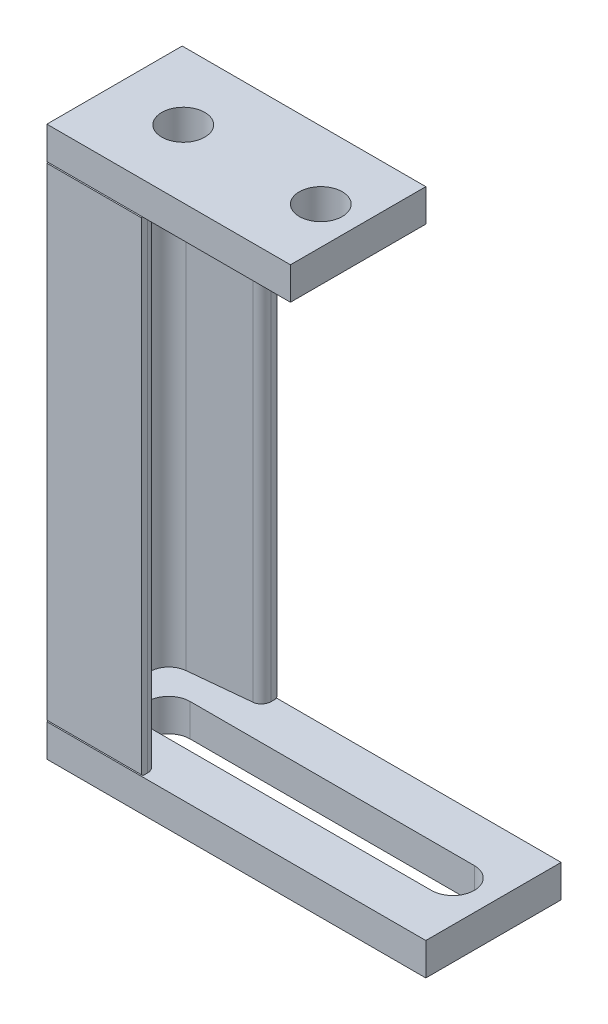
ISO-10303-21;
HEADER;
FILE_DESCRIPTION(('STEP AP214'),'2;1');
FILE_NAME('part.step','',(''),(''),'','','');
FILE_SCHEMA(('AUTOMOTIVE_DESIGN { 1 0 10303 214 1 1 1 1 }'));
ENDSEC;
DATA;
#1=APPLICATION_CONTEXT('core data for automotive mechanical design processes');
#2=APPLICATION_PROTOCOL_DEFINITION('international standard','automotive_design',2000,#1);
#3=PRODUCT_CONTEXT('',#1,'mechanical');
#4=PRODUCT('Part','Part','',(#3));
#5=PRODUCT_RELATED_PRODUCT_CATEGORY('part','',(#4));
#6=PRODUCT_DEFINITION_FORMATION('','',#4);
#7=PRODUCT_DEFINITION_CONTEXT('part definition',#1,'design');
#8=PRODUCT_DEFINITION('design','',#6,#7);
#9=PRODUCT_DEFINITION_SHAPE('','',#8);
#10=(LENGTH_UNIT() NAMED_UNIT(*) SI_UNIT(.MILLI.,.METRE.));
#11=(NAMED_UNIT(*) PLANE_ANGLE_UNIT() SI_UNIT($,.RADIAN.));
#12=(NAMED_UNIT(*) SI_UNIT($,.STERADIAN.) SOLID_ANGLE_UNIT());
#13=UNCERTAINTY_MEASURE_WITH_UNIT(LENGTH_MEASURE(1.E-05),#10,'distance_accuracy_value','');
#14=(GEOMETRIC_REPRESENTATION_CONTEXT(3) GLOBAL_UNCERTAINTY_ASSIGNED_CONTEXT((#13)) GLOBAL_UNIT_ASSIGNED_CONTEXT((#10,
#11,#12)) REPRESENTATION_CONTEXT('',''));
#15=CARTESIAN_POINT('',(0.,0.,0.));
#16=DIRECTION('',(0.,0.,1.));
#17=DIRECTION('',(1.,0.,0.));
#18=AXIS2_PLACEMENT_3D('',#15,#16,#17);
#19=CARTESIAN_POINT('',(35.,0.,0.));
#20=DIRECTION('',(1.,0.,0.));
#21=DIRECTION('',(0.,0.,-1.));
#22=AXIS2_PLACEMENT_3D('',#19,#20,#21);
#23=PLANE('',#22);
#24=DIRECTION('',(0.,0.,-1.));
#25=VECTOR('',#24,1.);
#26=CARTESIAN_POINT('',(35.,1.06001762654536E-08,0.));
#27=LINE('',#26,#25);
#28=CARTESIAN_POINT('',(35.,1.06001762654536E-08,24.5000000106002));
#29=VERTEX_POINT('',#28);
#30=CARTESIAN_POINT('',(35.,1.06001762654536E-08,22.7900106818747));
#31=VERTEX_POINT('',#30);
#32=EDGE_CURVE('E363',#29,#31,#27,.T.);
#33=ORIENTED_EDGE('',*,*,#32,.T.);
#34=DIRECTION('',(0.,1.,0.));
#35=VECTOR('',#34,1.);
#36=CARTESIAN_POINT('',(35.,179.2,22.7900106818747));
#37=LINE('',#36,#35);
#38=CARTESIAN_POINT('',(35.,179.2,22.7900106818747));
#39=VERTEX_POINT('',#38);
#40=EDGE_CURVE('E376',#31,#39,#37,.T.);
#41=ORIENTED_EDGE('',*,*,#40,.T.);
#42=DIRECTION('',(0.,0.,-1.));
#43=VECTOR('',#42,1.);
#44=CARTESIAN_POINT('',(35.,179.2,24.5));
#45=LINE('',#44,#43);
#46=CARTESIAN_POINT('',(35.,179.2,24.5));
#47=VERTEX_POINT('',#46);
#48=EDGE_CURVE('E307',#47,#39,#45,.T.);
#49=ORIENTED_EDGE('',*,*,#48,.F.);
#50=DIRECTION('',(0.,0.707106781186547,-0.707106781186547));
#51=VECTOR('',#50,1.);
#52=CARTESIAN_POINT('',(35.,178.7,25.));
#53=LINE('',#52,#51);
#54=CARTESIAN_POINT('',(35.,178.7,25.));
#55=VERTEX_POINT('',#54);
#56=EDGE_CURVE('E303',#55,#47,#53,.T.);
#57=ORIENTED_EDGE('',*,*,#56,.F.);
#58=DIRECTION('',(0.,1.,0.));
#59=VECTOR('',#58,1.);
#60=CARTESIAN_POINT('',(35.,0.5000000192,25.));
#61=LINE('',#60,#59);
#62=CARTESIAN_POINT('',(35.,0.5000000192,25.));
#63=VERTEX_POINT('',#62);
#64=EDGE_CURVE('E300',#63,#55,#61,.T.);
#65=ORIENTED_EDGE('',*,*,#64,.F.);
#66=DIRECTION('',(0.,0.707106794762982,0.707106767610112));
#67=VECTOR('',#66,1.);
#68=CARTESIAN_POINT('',(35.,0.,24.5));
#69=LINE('',#68,#67);
#70=EDGE_CURVE('E297',#29,#63,#69,.T.);
#71=ORIENTED_EDGE('',*,*,#70,.F.);
#72=EDGE_LOOP('',(#33,#41,#49,#57,#65,#71));
#73=FACE_BOUND('',#72,.T.);
#74=ADVANCED_FACE('F36',(#73),#23,.T.);
#75=CARTESIAN_POINT('',(35.,179.2,-22.7900106818747));
#76=VERTEX_POINT('',#75);
#77=CARTESIAN_POINT('',(35.,179.2,-24.5));
#78=VERTEX_POINT('',#77);
#79=EDGE_CURVE('E306',#76,#78,#45,.T.);
#80=ORIENTED_EDGE('',*,*,#79,.F.);
#81=DIRECTION('',(0.,-1.,0.));
#82=VECTOR('',#81,1.);
#83=CARTESIAN_POINT('',(35.,1.06001762041178E-08,-22.7900106818747));
#84=LINE('',#83,#82);
#85=CARTESIAN_POINT('',(35.,1.06001762654536E-08,-22.7900106818747));
#86=VERTEX_POINT('',#85);
#87=EDGE_CURVE('E381',#76,#86,#84,.T.);
#88=ORIENTED_EDGE('',*,*,#87,.T.);
#89=CARTESIAN_POINT('',(35.,1.06001762654536E-08,-24.5));
#90=VERTEX_POINT('',#89);
#91=EDGE_CURVE('E367',#86,#90,#27,.T.);
#92=ORIENTED_EDGE('',*,*,#91,.T.);
#93=DIRECTION('',(0.,-0.707106781186547,0.707106781186548));
#94=VECTOR('',#93,1.);
#95=CARTESIAN_POINT('',(35.,0.5,-25.));
#96=LINE('',#95,#94);
#97=CARTESIAN_POINT('',(35.,0.5,-25.));
#98=VERTEX_POINT('',#97);
#99=EDGE_CURVE('E293',#98,#90,#96,.T.);
#100=ORIENTED_EDGE('',*,*,#99,.F.);
#101=DIRECTION('',(0.,-1.,0.));
#102=VECTOR('',#101,1.);
#103=CARTESIAN_POINT('',(35.,178.7,-25.));
#104=LINE('',#103,#102);
#105=CARTESIAN_POINT('',(35.,178.7,-25.));
#106=VERTEX_POINT('',#105);
#107=EDGE_CURVE('E290',#106,#98,#104,.T.);
#108=ORIENTED_EDGE('',*,*,#107,.F.);
#109=DIRECTION('',(0.,-0.707106781186547,-0.707106781186547));
#110=VECTOR('',#109,1.);
#111=CARTESIAN_POINT('',(35.,179.2,-24.5));
#112=LINE('',#111,#110);
#113=EDGE_CURVE('E310',#78,#106,#112,.T.);
#114=ORIENTED_EDGE('',*,*,#113,.F.);
#115=EDGE_LOOP('',(#80,#88,#92,#100,#108,#114));
#116=FACE_BOUND('',#115,.T.);
#117=ADVANCED_FACE('F425',(#116),#23,.T.);
#118=CARTESIAN_POINT('',(90.,191.1999999944,25.));
#119=DIRECTION('',(0.,0.,1.));
#120=DIRECTION('',(1.,0.,0.));
#121=AXIS2_PLACEMENT_3D('',#118,#119,#120);
#122=PLANE('',#121);
#123=DIRECTION('',(-1.,0.,0.));
#124=VECTOR('',#123,1.);
#125=CARTESIAN_POINT('',(90.,179.2,25.));
#126=LINE('',#125,#124);
#127=CARTESIAN_POINT('',(90.,179.2,25.));
#128=VERTEX_POINT('',#127);
#129=CARTESIAN_POINT('',(0.,179.2,25.));
#130=VERTEX_POINT('',#129);
#131=EDGE_CURVE('E343',#128,#130,#126,.T.);
#132=ORIENTED_EDGE('',*,*,#131,.F.);
#133=DIRECTION('',(0.,-1.,0.));
#134=VECTOR('',#133,1.);
#135=CARTESIAN_POINT('',(90.,191.1999999944,25.));
#136=LINE('',#135,#134);
#137=CARTESIAN_POINT('',(90.,191.1999999944,25.));
#138=VERTEX_POINT('',#137);
#139=EDGE_CURVE('E461',#138,#128,#136,.T.);
#140=ORIENTED_EDGE('',*,*,#139,.F.);
#141=DIRECTION('',(-1.,0.,0.));
#142=VECTOR('',#141,1.);
#143=CARTESIAN_POINT('',(90.,191.1999999944,25.));
#144=LINE('',#143,#142);
#145=CARTESIAN_POINT('',(0.,191.1999999944,25.));
#146=VERTEX_POINT('',#145);
#147=EDGE_CURVE('E460',#138,#146,#144,.T.);
#148=ORIENTED_EDGE('',*,*,#147,.T.);
#149=DIRECTION('',(0.,-1.,0.));
#150=VECTOR('',#149,1.);
#151=CARTESIAN_POINT('',(0.,191.1999999944,25.));
#152=LINE('',#151,#150);
#153=EDGE_CURVE('E465',#146,#130,#152,.T.);
#154=ORIENTED_EDGE('',*,*,#153,.T.);
#155=EDGE_LOOP('',(#132,#140,#148,#154));
#156=FACE_BOUND('',#155,.T.);
#157=ADVANCED_FACE('F516',(#156),#122,.T.);
#158=CARTESIAN_POINT('',(90.,191.1999999944,-25.));
#159=DIRECTION('',(1.,0.,0.));
#160=DIRECTION('',(0.,0.,-1.));
#161=AXIS2_PLACEMENT_3D('',#158,#159,#160);
#162=PLANE('',#161);
#163=DIRECTION('',(0.,0.,1.));
#164=VECTOR('',#163,1.);
#165=CARTESIAN_POINT('',(90.,179.2,-25.));
#166=LINE('',#165,#164);
#167=CARTESIAN_POINT('',(90.,179.2,-25.));
#168=VERTEX_POINT('',#167);
#169=EDGE_CURVE('E457',#168,#128,#166,.T.);
#170=ORIENTED_EDGE('',*,*,#169,.F.);
#171=DIRECTION('',(0.,-1.,0.));
#172=VECTOR('',#171,1.);
#173=CARTESIAN_POINT('',(90.,191.1999999944,-25.));
#174=LINE('',#173,#172);
#175=CARTESIAN_POINT('',(90.,191.1999999944,-25.));
#176=VERTEX_POINT('',#175);
#177=EDGE_CURVE('E463',#176,#168,#174,.T.);
#178=ORIENTED_EDGE('',*,*,#177,.F.);
#179=DIRECTION('',(0.,0.,1.));
#180=VECTOR('',#179,1.);
#181=CARTESIAN_POINT('',(90.,191.1999999944,-25.));
#182=LINE('',#181,#180);
#183=EDGE_CURVE('E466',#176,#138,#182,.T.);
#184=ORIENTED_EDGE('',*,*,#183,.T.);
#185=ORIENTED_EDGE('',*,*,#139,.T.);
#186=EDGE_LOOP('',(#170,#178,#184,#185));
#187=FACE_BOUND('',#186,.T.);
#188=ADVANCED_FACE('F518',(#187),#162,.T.);
#189=CARTESIAN_POINT('',(0.,191.1999999944,-25.));
#190=DIRECTION('',(0.,0.,-1.));
#191=DIRECTION('',(-1.,0.,0.));
#192=AXIS2_PLACEMENT_3D('',#189,#190,#191);
#193=PLANE('',#192);
#194=DIRECTION('',(1.,0.,0.));
#195=VECTOR('',#194,1.);
#196=CARTESIAN_POINT('',(0.,179.2,-25.));
#197=LINE('',#196,#195);
#198=CARTESIAN_POINT('',(0.,179.2,-25.));
#199=VERTEX_POINT('',#198);
#200=EDGE_CURVE('E446',#199,#168,#197,.T.);
#201=ORIENTED_EDGE('',*,*,#200,.F.);
#202=DIRECTION('',(0.,-1.,0.));
#203=VECTOR('',#202,1.);
#204=CARTESIAN_POINT('',(0.,191.1999999944,-25.));
#205=LINE('',#204,#203);
#206=CARTESIAN_POINT('',(0.,191.1999999944,-25.));
#207=VERTEX_POINT('',#206);
#208=EDGE_CURVE('E441',#207,#199,#205,.T.);
#209=ORIENTED_EDGE('',*,*,#208,.F.);
#210=DIRECTION('',(1.,0.,0.));
#211=VECTOR('',#210,1.);
#212=CARTESIAN_POINT('',(0.,191.1999999944,-25.));
#213=LINE('',#212,#211);
#214=EDGE_CURVE('E471',#207,#176,#213,.T.);
#215=ORIENTED_EDGE('',*,*,#214,.T.);
#216=ORIENTED_EDGE('',*,*,#177,.T.);
#217=EDGE_LOOP('',(#201,#209,#215,#216));
#218=FACE_BOUND('',#217,.T.);
#219=ADVANCED_FACE('F520',(#218),#193,.T.);
#220=CARTESIAN_POINT('',(0.,191.1999999944,25.));
#221=DIRECTION('',(-1.,0.,0.));
#222=DIRECTION('',(0.,0.,1.));
#223=AXIS2_PLACEMENT_3D('',#220,#221,#222);
#224=PLANE('',#223);
#225=CARTESIAN_POINT('',(0.,89.6,0.));
#226=DIRECTION('',(-1.,0.,0.));
#227=DIRECTION('',(0.,0.,1.));
#228=AXIS2_PLACEMENT_3D('',#225,#226,#227);
#229=CIRCLE('',#228,7.93999999999999);
#230=CARTESIAN_POINT('',(0.,89.6,7.93999999999999));
#231=VERTEX_POINT('',#230);
#232=EDGE_CURVE('E588',#231,#231,#229,.T.);
#233=ORIENTED_EDGE('',*,*,#232,.F.);
#234=EDGE_LOOP('',(#233));
#235=FACE_BOUND('',#234,.T.);
#236=CARTESIAN_POINT('',(0.,115.,0.));
#237=DIRECTION('',(-1.,0.,0.));
#238=DIRECTION('',(0.,0.,1.));
#239=AXIS2_PLACEMENT_3D('',#236,#237,#238);
#240=CIRCLE('',#239,7.93999999999999);
#241=CARTESIAN_POINT('',(0.,115.,7.93999999999999));
#242=VERTEX_POINT('',#241);
#243=EDGE_CURVE('E599',#242,#242,#240,.T.);
#244=ORIENTED_EDGE('',*,*,#243,.F.);
#245=EDGE_LOOP('',(#244));
#246=FACE_BOUND('',#245,.T.);
#247=CARTESIAN_POINT('',(0.,140.4,0.));
#248=DIRECTION('',(-1.,0.,0.));
#249=DIRECTION('',(0.,0.,1.));
#250=AXIS2_PLACEMENT_3D('',#247,#248,#249);
#251=CIRCLE('',#250,7.93999999999997);
#252=CARTESIAN_POINT('',(0.,140.4,7.93999999999997));
#253=VERTEX_POINT('',#252);
#254=EDGE_CURVE('E605',#253,#253,#251,.T.);
#255=ORIENTED_EDGE('',*,*,#254,.F.);
#256=EDGE_LOOP('',(#255));
#257=FACE_BOUND('',#256,.T.);
#258=CARTESIAN_POINT('',(0.,165.8,0.));
#259=DIRECTION('',(-1.,0.,0.));
#260=DIRECTION('',(0.,0.,1.));
#261=AXIS2_PLACEMENT_3D('',#258,#259,#260);
#262=CIRCLE('',#261,7.94);
#263=CARTESIAN_POINT('',(0.,165.8,7.94));
#264=VERTEX_POINT('',#263);
#265=EDGE_CURVE('E611',#264,#264,#262,.T.);
#266=ORIENTED_EDGE('',*,*,#265,.F.);
#267=EDGE_LOOP('',(#266));
#268=FACE_BOUND('',#267,.T.);
#269=CARTESIAN_POINT('',(0.,38.8,0.));
#270=DIRECTION('',(-1.,0.,0.));
#271=DIRECTION('',(0.,0.,1.));
#272=AXIS2_PLACEMENT_3D('',#269,#270,#271);
#273=CIRCLE('',#272,7.93999999999999);
#274=CARTESIAN_POINT('',(0.,38.8,7.93999999999999));
#275=VERTEX_POINT('',#274);
#276=EDGE_CURVE('E246',#275,#275,#273,.T.);
#277=ORIENTED_EDGE('',*,*,#276,.F.);
#278=EDGE_LOOP('',(#277));
#279=FACE_BOUND('',#278,.T.);
#280=DIRECTION('',(0.,0.,-1.));
#281=VECTOR('',#280,1.);
#282=CARTESIAN_POINT('',(0.,179.2,25.));
#283=LINE('',#282,#281);
#284=CARTESIAN_POINT('',(0.,179.2,24.5));
#285=VERTEX_POINT('',#284);
#286=EDGE_CURVE('E443',#130,#285,#283,.T.);
#287=ORIENTED_EDGE('',*,*,#286,.F.);
#288=ORIENTED_EDGE('',*,*,#153,.F.);
#289=DIRECTION('',(0.,0.,-1.));
#290=VECTOR('',#289,1.);
#291=CARTESIAN_POINT('',(0.,191.1999999944,25.));
#292=LINE('',#291,#290);
#293=EDGE_CURVE('E475',#146,#207,#292,.T.);
#294=ORIENTED_EDGE('',*,*,#293,.T.);
#295=ORIENTED_EDGE('',*,*,#208,.T.);
#296=CARTESIAN_POINT('',(0.,179.2,-24.5));
#297=VERTEX_POINT('',#296);
#298=EDGE_CURVE('E435',#297,#199,#283,.T.);
#299=ORIENTED_EDGE('',*,*,#298,.F.);
#300=DIRECTION('',(0.,-0.707106781186547,-0.707106781186547));
#301=VECTOR('',#300,1.);
#302=CARTESIAN_POINT('',(0.,179.2,-24.5));
#303=LINE('',#302,#301);
#304=CARTESIAN_POINT('',(0.,178.7,-25.));
#305=VERTEX_POINT('',#304);
#306=EDGE_CURVE('E294',#297,#305,#303,.T.);
#307=ORIENTED_EDGE('',*,*,#306,.T.);
#308=DIRECTION('',(0.,-1.,0.));
#309=VECTOR('',#308,1.);
#310=CARTESIAN_POINT('',(0.,178.7,-25.));
#311=LINE('',#310,#309);
#312=CARTESIAN_POINT('',(0.,0.5,-25.));
#313=VERTEX_POINT('',#312);
#314=EDGE_CURVE('E289',#305,#313,#311,.T.);
#315=ORIENTED_EDGE('',*,*,#314,.T.);
#316=DIRECTION('',(0.,-0.707106781186547,0.707106781186548));
#317=VECTOR('',#316,1.);
#318=CARTESIAN_POINT('',(0.,0.5,-25.));
#319=LINE('',#318,#317);
#320=CARTESIAN_POINT('',(0.,0.,-24.5));
#321=VERTEX_POINT('',#320);
#322=EDGE_CURVE('E316',#313,#321,#319,.T.);
#323=ORIENTED_EDGE('',*,*,#322,.T.);
#324=DIRECTION('',(0.,0.,-1.));
#325=VECTOR('',#324,1.);
#326=CARTESIAN_POINT('',(0.,0.,-24.5));
#327=LINE('',#326,#325);
#328=CARTESIAN_POINT('',(0.,0.,-25.));
#329=VERTEX_POINT('',#328);
#330=EDGE_CURVE('E319',#321,#329,#327,.T.);
#331=ORIENTED_EDGE('',*,*,#330,.T.);
#332=DIRECTION('',(0.,-1.,0.));
#333=VECTOR('',#332,1.);
#334=CARTESIAN_POINT('',(0.,0.,-25.));
#335=LINE('',#334,#333);
#336=CARTESIAN_POINT('',(0.,-12.,-25.));
#337=VERTEX_POINT('',#336);
#338=EDGE_CURVE('E322',#329,#337,#335,.T.);
#339=ORIENTED_EDGE('',*,*,#338,.T.);
#340=DIRECTION('',(0.,0.,1.));
#341=VECTOR('',#340,1.);
#342=CARTESIAN_POINT('',(0.,-12.,-25.));
#343=LINE('',#342,#341);
#344=CARTESIAN_POINT('',(0.,-12.,25.));
#345=VERTEX_POINT('',#344);
#346=EDGE_CURVE('E325',#337,#345,#343,.T.);
#347=ORIENTED_EDGE('',*,*,#346,.T.);
#348=DIRECTION('',(0.,1.,0.));
#349=VECTOR('',#348,1.);
#350=CARTESIAN_POINT('',(0.,-12.,25.));
#351=LINE('',#350,#349);
#352=CARTESIAN_POINT('',(0.,0.,25.));
#353=VERTEX_POINT('',#352);
#354=EDGE_CURVE('E328',#345,#353,#351,.T.);
#355=ORIENTED_EDGE('',*,*,#354,.T.);
#356=DIRECTION('',(0.,0.,-1.));
#357=VECTOR('',#356,1.);
#358=CARTESIAN_POINT('',(0.,0.,25.));
#359=LINE('',#358,#357);
#360=CARTESIAN_POINT('',(0.,0.,24.5));
#361=VERTEX_POINT('',#360);
#362=EDGE_CURVE('E331',#353,#361,#359,.T.);
#363=ORIENTED_EDGE('',*,*,#362,.T.);
#364=DIRECTION('',(0.,0.707106794762982,0.707106767610112));
#365=VECTOR('',#364,1.);
#366=CARTESIAN_POINT('',(0.,0.,24.5));
#367=LINE('',#366,#365);
#368=CARTESIAN_POINT('',(0.,0.5000000192,25.));
#369=VERTEX_POINT('',#368);
#370=EDGE_CURVE('E334',#361,#369,#367,.T.);
#371=ORIENTED_EDGE('',*,*,#370,.T.);
#372=DIRECTION('',(0.,1.,0.));
#373=VECTOR('',#372,1.);
#374=CARTESIAN_POINT('',(0.,0.5000000192,25.));
#375=LINE('',#374,#373);
#376=CARTESIAN_POINT('',(0.,178.7,25.));
#377=VERTEX_POINT('',#376);
#378=EDGE_CURVE('E337',#369,#377,#375,.T.);
#379=ORIENTED_EDGE('',*,*,#378,.T.);
#380=DIRECTION('',(0.,0.707106781186547,-0.707106781186547));
#381=VECTOR('',#380,1.);
#382=CARTESIAN_POINT('',(0.,178.7,25.));
#383=LINE('',#382,#381);
#384=EDGE_CURVE('E340',#377,#285,#383,.T.);
#385=ORIENTED_EDGE('',*,*,#384,.T.);
#386=EDGE_LOOP('',(#287,#288,#294,#295,#299,#307,#315,#323,#331,#339,#347,#355,#363,#371,#379,#385));
#387=FACE_BOUND('',#386,.T.);
#388=ADVANCED_FACE('F439',(#235,#246,#257,#268,#279,#387),#224,.T.);
#389=CARTESIAN_POINT('',(0.,191.1999999944,0.));
#390=DIRECTION('',(0.,-1.,0.));
#391=DIRECTION('',(0.,0.,-1.));
#392=AXIS2_PLACEMENT_3D('',#389,#390,#391);
#393=PLANE('',#392);
#394=CARTESIAN_POINT('',(76.2,191.1999999944,0.));
#395=DIRECTION('',(0.,-1.,0.));
#396=DIRECTION('',(0.,0.,-1.));
#397=AXIS2_PLACEMENT_3D('',#394,#395,#396);
#398=CIRCLE('',#397,7.93999999999999);
#399=CARTESIAN_POINT('',(76.2,191.1999999944,-7.93999999999999));
#400=VERTEX_POINT('',#399);
#401=EDGE_CURVE('E585',#400,#400,#398,.T.);
#402=ORIENTED_EDGE('',*,*,#401,.T.);
#403=EDGE_LOOP('',(#402));
#404=FACE_BOUND('',#403,.T.);
#405=CARTESIAN_POINT('',(25.4,191.1999999944,0.));
#406=DIRECTION('',(0.,-1.,0.));
#407=DIRECTION('',(0.,0.,-1.));
#408=AXIS2_PLACEMENT_3D('',#405,#406,#407);
#409=CIRCLE('',#408,7.93999999999999);
#410=CARTESIAN_POINT('',(25.4,191.1999999944,-7.93999999999999));
#411=VERTEX_POINT('',#410);
#412=EDGE_CURVE('E584',#411,#411,#409,.T.);
#413=ORIENTED_EDGE('',*,*,#412,.T.);
#414=EDGE_LOOP('',(#413));
#415=FACE_BOUND('',#414,.T.);
#416=ORIENTED_EDGE('',*,*,#147,.F.);
#417=ORIENTED_EDGE('',*,*,#183,.F.);
#418=ORIENTED_EDGE('',*,*,#214,.F.);
#419=ORIENTED_EDGE('',*,*,#293,.F.);
#420=EDGE_LOOP('',(#416,#417,#418,#419));
#421=FACE_BOUND('',#420,.T.);
#422=ADVANCED_FACE('F515',(#404,#415,#421),#393,.F.);
#423=CARTESIAN_POINT('',(0.,179.2,0.));
#424=DIRECTION('',(0.,-1.,0.));
#425=DIRECTION('',(0.,0.,-1.));
#426=AXIS2_PLACEMENT_3D('',#423,#424,#425);
#427=PLANE('',#426);
#428=CARTESIAN_POINT('',(76.2,179.2,0.));
#429=DIRECTION('',(0.,-1.,0.));
#430=DIRECTION('',(0.,0.,-1.));
#431=AXIS2_PLACEMENT_3D('',#428,#429,#430);
#432=CIRCLE('',#431,7.93999999999999);
#433=CARTESIAN_POINT('',(76.2,179.2,-7.93999999999999));
#434=VERTEX_POINT('',#433);
#435=EDGE_CURVE('E579',#434,#434,#432,.T.);
#436=ORIENTED_EDGE('',*,*,#435,.F.);
#437=EDGE_LOOP('',(#436));
#438=FACE_BOUND('',#437,.T.);
#439=CARTESIAN_POINT('',(25.4,179.2,0.));
#440=DIRECTION('',(0.,-1.,0.));
#441=DIRECTION('',(0.,0.,-1.));
#442=AXIS2_PLACEMENT_3D('',#439,#440,#441);
#443=CIRCLE('',#442,7.93999999999999);
#444=CARTESIAN_POINT('',(25.4,179.2,-7.93999999999999));
#445=VERTEX_POINT('',#444);
#446=EDGE_CURVE('E582',#445,#445,#443,.T.);
#447=ORIENTED_EDGE('',*,*,#446,.F.);
#448=EDGE_LOOP('',(#447));
#449=FACE_BOUND('',#448,.T.);
#450=DIRECTION('',(0.,0.,1.));
#451=VECTOR('',#450,1.);
#452=CARTESIAN_POINT('',(2.99999999999999,179.2000000106,-16.427941006442));
#453=LINE('',#452,#451);
#454=CARTESIAN_POINT('',(2.99999999999999,179.2000000106,-10.0918509002509));
#455=VERTEX_POINT('',#454);
#456=CARTESIAN_POINT('',(2.99999999999999,179.2000000106,10.0918509002509));
#457=VERTEX_POINT('',#456);
#458=EDGE_CURVE('E272',#455,#457,#453,.T.);
#459=ORIENTED_EDGE('',*,*,#458,.F.);
#460=CARTESIAN_POINT('',(9.99999999999999,179.2,-10.0918509002509));
#461=DIRECTION('',(0.,-1.,0.));
#462=DIRECTION('',(0.,0.,-1.));
#463=AXIS2_PLACEMENT_3D('',#460,#461,#462);
#464=CIRCLE('',#463,7.);
#465=CARTESIAN_POINT('',(9.30476175195621,179.2,-17.0572398899957));
#466=VERTEX_POINT('',#465);
#467=EDGE_CURVE('E401',#455,#466,#464,.T.);
#468=ORIENTED_EDGE('',*,*,#467,.T.);
#469=DIRECTION('',(-0.995055569963532,0.,0.0993197497205395));
#470=VECTOR('',#469,1.);
#471=CARTESIAN_POINT('',(-1.59395832519176,179.2,-15.9694030062966));
#472=LINE('',#471,#470);
#473=CARTESIAN_POINT('',(31.8476191240219,179.2,-19.3073161870023));
#474=VERTEX_POINT('',#473);
#475=EDGE_CURVE('E370',#466,#474,#472,.F.);
#476=ORIENTED_EDGE('',*,*,#475,.T.);
#477=CARTESIAN_POINT('',(31.5,179.2,-22.7900106818747));
#478=DIRECTION('',(0.,-1.,0.));
#479=DIRECTION('',(0.,0.,-1.));
#480=AXIS2_PLACEMENT_3D('',#477,#478,#479);
#481=CIRCLE('',#480,3.5);
#482=EDGE_CURVE('E388',#474,#76,#481,.F.);
#483=ORIENTED_EDGE('',*,*,#482,.T.);
#484=ORIENTED_EDGE('',*,*,#79,.T.);
#485=DIRECTION('',(-1.,0.,0.));
#486=VECTOR('',#485,1.);
#487=CARTESIAN_POINT('',(35.,179.2,-24.5));
#488=LINE('',#487,#486);
#489=EDGE_CURVE('E344',#78,#297,#488,.T.);
#490=ORIENTED_EDGE('',*,*,#489,.T.);
#491=ORIENTED_EDGE('',*,*,#298,.T.);
#492=ORIENTED_EDGE('',*,*,#200,.T.);
#493=ORIENTED_EDGE('',*,*,#169,.T.);
#494=ORIENTED_EDGE('',*,*,#131,.T.);
#495=ORIENTED_EDGE('',*,*,#286,.T.);
#496=DIRECTION('',(-1.,0.,0.));
#497=VECTOR('',#496,1.);
#498=CARTESIAN_POINT('',(35.,179.2,24.5));
#499=LINE('',#498,#497);
#500=EDGE_CURVE('E353',#47,#285,#499,.T.);
#501=ORIENTED_EDGE('',*,*,#500,.F.);
#502=ORIENTED_EDGE('',*,*,#48,.T.);
#503=CARTESIAN_POINT('',(31.5,179.2,22.7900106818747));
#504=DIRECTION('',(0.,-1.,0.));
#505=DIRECTION('',(0.,0.,-1.));
#506=AXIS2_PLACEMENT_3D('',#503,#504,#505);
#507=CIRCLE('',#506,3.5);
#508=CARTESIAN_POINT('',(31.8476191240219,179.2,19.3073161870023));
#509=VERTEX_POINT('',#508);
#510=EDGE_CURVE('E385',#39,#509,#507,.F.);
#511=ORIENTED_EDGE('',*,*,#510,.T.);
#512=DIRECTION('',(-0.995055569963532,0.,-0.0993197497205395));
#513=VECTOR('',#512,1.);
#514=CARTESIAN_POINT('',(2.99999999999999,179.2,16.427941006442));
#515=LINE('',#514,#513);
#516=CARTESIAN_POINT('',(9.30476175195621,179.2,17.0572398899957));
#517=VERTEX_POINT('',#516);
#518=EDGE_CURVE('E280',#517,#509,#515,.F.);
#519=ORIENTED_EDGE('',*,*,#518,.F.);
#520=CARTESIAN_POINT('',(9.99999999999999,179.2,10.0918509002509));
#521=DIRECTION('',(0.,-1.,0.));
#522=DIRECTION('',(0.,0.,-1.));
#523=AXIS2_PLACEMENT_3D('',#520,#521,#522);
#524=CIRCLE('',#523,7.);
#525=EDGE_CURVE('E399',#517,#457,#524,.T.);
#526=ORIENTED_EDGE('',*,*,#525,.T.);
#527=EDGE_LOOP('',(#459,#468,#476,#483,#484,#490,#491,#492,#493,#494,#495,#501,#502,#511,#519,#526));
#528=FACE_BOUND('',#527,.T.);
#529=ADVANCED_FACE('F413',(#438,#449,#528),#427,.T.);
#530=CARTESIAN_POINT('',(35.,178.7,-25.));
#531=DIRECTION('',(0.,0.,-1.));
#532=DIRECTION('',(-1.,0.,0.));
#533=AXIS2_PLACEMENT_3D('',#530,#531,#532);
#534=PLANE('',#533);
#535=ORIENTED_EDGE('',*,*,#314,.F.);
#536=DIRECTION('',(-1.,0.,0.));
#537=VECTOR('',#536,1.);
#538=CARTESIAN_POINT('',(35.,178.7,-25.));
#539=LINE('',#538,#537);
#540=EDGE_CURVE('E341',#106,#305,#539,.T.);
#541=ORIENTED_EDGE('',*,*,#540,.F.);
#542=ORIENTED_EDGE('',*,*,#107,.T.);
#543=DIRECTION('',(-1.,0.,0.));
#544=VECTOR('',#543,1.);
#545=CARTESIAN_POINT('',(35.,0.5,-25.));
#546=LINE('',#545,#544);
#547=EDGE_CURVE('E313',#98,#313,#546,.T.);
#548=ORIENTED_EDGE('',*,*,#547,.T.);
#549=EDGE_LOOP('',(#535,#541,#542,#548));
#550=FACE_BOUND('',#549,.T.);
#551=ADVANCED_FACE('F541',(#550),#534,.T.);
#552=CARTESIAN_POINT('',(35.,179.2,-24.5));
#553=DIRECTION('',(0.,0.707106781186548,-0.707106781186548));
#554=DIRECTION('',(0.,0.707106781186548,0.707106781186548));
#555=AXIS2_PLACEMENT_3D('',#552,#553,#554);
#556=PLANE('',#555);
#557=ORIENTED_EDGE('',*,*,#306,.F.);
#558=ORIENTED_EDGE('',*,*,#489,.F.);
#559=ORIENTED_EDGE('',*,*,#113,.T.);
#560=ORIENTED_EDGE('',*,*,#540,.T.);
#561=EDGE_LOOP('',(#557,#558,#559,#560));
#562=FACE_BOUND('',#561,.T.);
#563=ADVANCED_FACE('F430',(#562),#556,.T.);
#564=CARTESIAN_POINT('',(35.,178.7,25.));
#565=DIRECTION('',(0.,0.707106781186548,0.707106781186548));
#566=DIRECTION('',(0.,-0.707106781186548,0.707106781186548));
#567=AXIS2_PLACEMENT_3D('',#564,#565,#566);
#568=PLANE('',#567);
#569=ORIENTED_EDGE('',*,*,#384,.F.);
#570=DIRECTION('',(-1.,0.,0.));
#571=VECTOR('',#570,1.);
#572=CARTESIAN_POINT('',(35.,178.7,25.));
#573=LINE('',#572,#571);
#574=EDGE_CURVE('E347',#55,#377,#573,.T.);
#575=ORIENTED_EDGE('',*,*,#574,.F.);
#576=ORIENTED_EDGE('',*,*,#56,.T.);
#577=ORIENTED_EDGE('',*,*,#500,.T.);
#578=EDGE_LOOP('',(#569,#575,#576,#577));
#579=FACE_BOUND('',#578,.T.);
#580=ADVANCED_FACE('F502',(#579),#568,.T.);
#581=CARTESIAN_POINT('',(35.,0.5000000192,25.));
#582=DIRECTION('',(0.,0.,1.));
#583=DIRECTION('',(0.,-1.,0.));
#584=AXIS2_PLACEMENT_3D('',#581,#582,#583);
#585=PLANE('',#584);
#586=ORIENTED_EDGE('',*,*,#378,.F.);
#587=DIRECTION('',(-1.,0.,0.));
#588=VECTOR('',#587,1.);
#589=CARTESIAN_POINT('',(35.,0.5000000192,25.));
#590=LINE('',#589,#588);
#591=EDGE_CURVE('E492',#63,#369,#590,.T.);
#592=ORIENTED_EDGE('',*,*,#591,.F.);
#593=ORIENTED_EDGE('',*,*,#64,.T.);
#594=ORIENTED_EDGE('',*,*,#574,.T.);
#595=EDGE_LOOP('',(#586,#592,#593,#594));
#596=FACE_BOUND('',#595,.T.);
#597=ADVANCED_FACE('F498',(#596),#585,.T.);
#598=CARTESIAN_POINT('',(35.,0.,24.5));
#599=DIRECTION('',(0.,-0.707106767610112,0.707106794762982));
#600=DIRECTION('',(0.,-0.707106794762982,-0.707106767610112));
#601=AXIS2_PLACEMENT_3D('',#598,#599,#600);
#602=PLANE('',#601);
#603=ORIENTED_EDGE('',*,*,#370,.F.);
#604=DIRECTION('',(-1.,0.,0.));
#605=VECTOR('',#604,1.);
#606=CARTESIAN_POINT('',(35.,0.,24.5));
#607=LINE('',#606,#605);
#608=EDGE_CURVE('E491',#29,#361,#607,.T.);
#609=ORIENTED_EDGE('',*,*,#608,.F.);
#610=ORIENTED_EDGE('',*,*,#70,.T.);
#611=ORIENTED_EDGE('',*,*,#591,.T.);
#612=EDGE_LOOP('',(#603,#609,#610,#611));
#613=FACE_BOUND('',#612,.T.);
#614=ADVANCED_FACE('F506',(#613),#602,.T.);
#615=CARTESIAN_POINT('',(35.,0.,25.));
#616=DIRECTION('',(0.,1.,0.));
#617=DIRECTION('',(0.,0.,1.));
#618=AXIS2_PLACEMENT_3D('',#615,#616,#617);
#619=PLANE('',#618);
#620=DIRECTION('',(-1.,0.,0.));
#621=VECTOR('',#620,1.);
#622=CARTESIAN_POINT('',(125.,0.,7.94000000000001));
#623=LINE('',#622,#621);
#624=CARTESIAN_POINT('',(125.,0.,7.94000000000001));
#625=VERTEX_POINT('',#624);
#626=CARTESIAN_POINT('',(20.,0.,7.94));
#627=VERTEX_POINT('',#626);
#628=EDGE_CURVE('E245',#625,#627,#623,.T.);
#629=ORIENTED_EDGE('',*,*,#628,.T.);
#630=CARTESIAN_POINT('',(20.,0.,0.));
#631=DIRECTION('',(0.,1.,0.));
#632=DIRECTION('',(0.,0.,1.));
#633=AXIS2_PLACEMENT_3D('',#630,#631,#632);
#634=CIRCLE('',#633,7.94);
#635=CARTESIAN_POINT('',(20.,0.,-7.94));
#636=VERTEX_POINT('',#635);
#637=EDGE_CURVE('E232',#627,#636,#634,.F.);
#638=ORIENTED_EDGE('',*,*,#637,.T.);
#639=DIRECTION('',(1.,0.,0.));
#640=VECTOR('',#639,1.);
#641=CARTESIAN_POINT('',(20.,0.,-7.94000000000001));
#642=LINE('',#641,#640);
#643=CARTESIAN_POINT('',(125.,0.,-7.94000000000001));
#644=VERTEX_POINT('',#643);
#645=EDGE_CURVE('E221',#636,#644,#642,.T.);
#646=ORIENTED_EDGE('',*,*,#645,.T.);
#647=CARTESIAN_POINT('',(125.,0.,0.));
#648=DIRECTION('',(0.,1.,0.));
#649=DIRECTION('',(0.,0.,1.));
#650=AXIS2_PLACEMENT_3D('',#647,#648,#649);
#651=CIRCLE('',#650,7.94000000000001);
#652=EDGE_CURVE('E231',#644,#625,#651,.F.);
#653=ORIENTED_EDGE('',*,*,#652,.T.);
#654=EDGE_LOOP('',(#629,#638,#646,#653));
#655=FACE_BOUND('',#654,.T.);
#656=DIRECTION('',(-0.995055569963532,0.,0.0993197497205395));
#657=VECTOR('',#656,1.);
#658=CARTESIAN_POINT('',(2.99999999999999,0.,-16.427941006442));
#659=LINE('',#658,#657);
#660=CARTESIAN_POINT('',(9.30476175195621,0.,-17.0572398899957));
#661=VERTEX_POINT('',#660);
#662=CARTESIAN_POINT('',(31.8476191240219,0.,-19.3073161870023));
#663=VERTEX_POINT('',#662);
#664=EDGE_CURVE('E368',#661,#663,#659,.F.);
#665=ORIENTED_EDGE('',*,*,#664,.F.);
#666=CARTESIAN_POINT('',(9.99999999999999,0.,-10.0918509002509));
#667=DIRECTION('',(0.,1.,0.));
#668=DIRECTION('',(0.,0.,1.));
#669=AXIS2_PLACEMENT_3D('',#666,#667,#668);
#670=CIRCLE('',#669,7.);
#671=CARTESIAN_POINT('',(2.99999999999999,1.06001762654536E-08,-10.0918509002509));
#672=VERTEX_POINT('',#671);
#673=EDGE_CURVE('E44',#661,#672,#670,.T.);
#674=ORIENTED_EDGE('',*,*,#673,.T.);
#675=DIRECTION('',(0.,0.,-1.));
#676=VECTOR('',#675,1.);
#677=CARTESIAN_POINT('',(2.99999999999999,1.06001762654536E-08,16.427941006442));
#678=LINE('',#677,#676);
#679=CARTESIAN_POINT('',(2.99999999999999,1.06001762654536E-08,10.0918509002509));
#680=VERTEX_POINT('',#679);
#681=EDGE_CURVE('E269',#680,#672,#678,.T.);
#682=ORIENTED_EDGE('',*,*,#681,.F.);
#683=CARTESIAN_POINT('',(9.99999999999999,0.,10.0918509002509));
#684=DIRECTION('',(0.,1.,0.));
#685=DIRECTION('',(0.,0.,1.));
#686=AXIS2_PLACEMENT_3D('',#683,#684,#685);
#687=CIRCLE('',#686,7.);
#688=CARTESIAN_POINT('',(9.30476175195621,0.,17.0572398899957));
#689=VERTEX_POINT('',#688);
#690=EDGE_CURVE('E51',#680,#689,#687,.T.);
#691=ORIENTED_EDGE('',*,*,#690,.T.);
#692=DIRECTION('',(-0.995055569963532,0.,-0.0993197497205395));
#693=VECTOR('',#692,1.);
#694=CARTESIAN_POINT('',(35.5315039850191,0.,19.6750167792486));
#695=LINE('',#694,#693);
#696=CARTESIAN_POINT('',(31.8476191240219,0.,19.3073161870023));
#697=VERTEX_POINT('',#696);
#698=EDGE_CURVE('E275',#689,#697,#695,.F.);
#699=ORIENTED_EDGE('',*,*,#698,.T.);
#700=CARTESIAN_POINT('',(31.5,0.,22.7900106818747));
#701=DIRECTION('',(0.,1.,0.));
#702=DIRECTION('',(0.,0.,1.));
#703=AXIS2_PLACEMENT_3D('',#700,#701,#702);
#704=CIRCLE('',#703,3.5);
#705=EDGE_CURVE('E383',#697,#31,#704,.F.);
#706=ORIENTED_EDGE('',*,*,#705,.T.);
#707=ORIENTED_EDGE('',*,*,#32,.F.);
#708=ORIENTED_EDGE('',*,*,#608,.T.);
#709=ORIENTED_EDGE('',*,*,#362,.F.);
#710=DIRECTION('',(-1.,0.,0.));
#711=VECTOR('',#710,1.);
#712=CARTESIAN_POINT('',(35.,0.,25.));
#713=LINE('',#712,#711);
#714=CARTESIAN_POINT('',(140.,1.06001762654536E-08,25.));
#715=VERTEX_POINT('',#714);
#716=EDGE_CURVE('E489',#715,#353,#713,.T.);
#717=ORIENTED_EDGE('',*,*,#716,.F.);
#718=DIRECTION('',(0.,0.,1.));
#719=VECTOR('',#718,1.);
#720=CARTESIAN_POINT('',(140.,1.06001762654536E-08,25.));
#721=LINE('',#720,#719);
#722=CARTESIAN_POINT('',(140.,1.06001762654536E-08,-25.));
#723=VERTEX_POINT('',#722);
#724=EDGE_CURVE('E283',#723,#715,#721,.T.);
#725=ORIENTED_EDGE('',*,*,#724,.F.);
#726=DIRECTION('',(-1.,0.,0.));
#727=VECTOR('',#726,1.);
#728=CARTESIAN_POINT('',(35.,0.,-25.));
#729=LINE('',#728,#727);
#730=EDGE_CURVE('E483',#723,#329,#729,.T.);
#731=ORIENTED_EDGE('',*,*,#730,.T.);
#732=ORIENTED_EDGE('',*,*,#330,.F.);
#733=DIRECTION('',(-1.,0.,0.));
#734=VECTOR('',#733,1.);
#735=CARTESIAN_POINT('',(35.,0.,-24.5));
#736=LINE('',#735,#734);
#737=EDGE_CURVE('E481',#90,#321,#736,.T.);
#738=ORIENTED_EDGE('',*,*,#737,.F.);
#739=ORIENTED_EDGE('',*,*,#91,.F.);
#740=CARTESIAN_POINT('',(31.5,0.,-22.7900106818747));
#741=DIRECTION('',(0.,1.,0.));
#742=DIRECTION('',(0.,0.,1.));
#743=AXIS2_PLACEMENT_3D('',#740,#741,#742);
#744=CIRCLE('',#743,3.5);
#745=EDGE_CURVE('E390',#86,#663,#744,.F.);
#746=ORIENTED_EDGE('',*,*,#745,.T.);
#747=EDGE_LOOP('',(#665,#674,#682,#691,#699,#706,#707,#708,#709,#717,#725,#731,#732,#738,#739,#746));
#748=FACE_BOUND('',#747,.T.);
#749=ADVANCED_FACE('F243',(#655,#748),#619,.T.);
#750=CARTESIAN_POINT('',(35.,-12.,25.));
#751=DIRECTION('',(0.,0.,1.));
#752=DIRECTION('',(1.,0.,0.));
#753=AXIS2_PLACEMENT_3D('',#750,#751,#752);
#754=PLANE('',#753);
#755=ORIENTED_EDGE('',*,*,#354,.F.);
#756=DIRECTION('',(-1.,0.,0.));
#757=VECTOR('',#756,1.);
#758=CARTESIAN_POINT('',(35.,-12.,25.));
#759=LINE('',#758,#757);
#760=CARTESIAN_POINT('',(140.,-11.9999999893998,25.));
#761=VERTEX_POINT('',#760);
#762=EDGE_CURVE('E487',#761,#345,#759,.T.);
#763=ORIENTED_EDGE('',*,*,#762,.F.);
#764=DIRECTION('',(0.,-1.,0.));
#765=VECTOR('',#764,1.);
#766=CARTESIAN_POINT('',(140.,-11.9999999893998,25.));
#767=LINE('',#766,#765);
#768=EDGE_CURVE('E286',#715,#761,#767,.T.);
#769=ORIENTED_EDGE('',*,*,#768,.F.);
#770=ORIENTED_EDGE('',*,*,#716,.T.);
#771=EDGE_LOOP('',(#755,#763,#769,#770));
#772=FACE_BOUND('',#771,.T.);
#773=ADVANCED_FACE('F550',(#772),#754,.T.);
#774=CARTESIAN_POINT('',(35.,-12.,-25.));
#775=DIRECTION('',(0.,-1.,0.));
#776=DIRECTION('',(0.,0.,-1.));
#777=AXIS2_PLACEMENT_3D('',#774,#775,#776);
#778=PLANE('',#777);
#779=DIRECTION('',(-1.,0.,0.));
#780=VECTOR('',#779,1.);
#781=CARTESIAN_POINT('',(125.,-12.,7.94000000000001));
#782=LINE('',#781,#780);
#783=CARTESIAN_POINT('',(125.,-12.,7.94000000000001));
#784=VERTEX_POINT('',#783);
#785=CARTESIAN_POINT('',(20.,-12.,7.94));
#786=VERTEX_POINT('',#785);
#787=EDGE_CURVE('E258',#784,#786,#782,.T.);
#788=ORIENTED_EDGE('',*,*,#787,.F.);
#789=CARTESIAN_POINT('',(125.,-12.,0.));
#790=DIRECTION('',(0.,-1.,0.));
#791=DIRECTION('',(0.,0.,-1.));
#792=AXIS2_PLACEMENT_3D('',#789,#790,#791);
#793=CIRCLE('',#792,7.94000000000001);
#794=CARTESIAN_POINT('',(125.,-12.,-7.94000000000001));
#795=VERTEX_POINT('',#794);
#796=EDGE_CURVE('E255',#795,#784,#793,.T.);
#797=ORIENTED_EDGE('',*,*,#796,.F.);
#798=DIRECTION('',(1.,0.,0.));
#799=VECTOR('',#798,1.);
#800=CARTESIAN_POINT('',(20.,-12.,-7.94000000000001));
#801=LINE('',#800,#799);
#802=CARTESIAN_POINT('',(20.,-12.,-7.94));
#803=VERTEX_POINT('',#802);
#804=EDGE_CURVE('E262',#803,#795,#801,.T.);
#805=ORIENTED_EDGE('',*,*,#804,.F.);
#806=CARTESIAN_POINT('',(20.,-12.,0.));
#807=DIRECTION('',(0.,-1.,0.));
#808=DIRECTION('',(0.,0.,-1.));
#809=AXIS2_PLACEMENT_3D('',#806,#807,#808);
#810=CIRCLE('',#809,7.94);
#811=EDGE_CURVE('E238',#786,#803,#810,.T.);
#812=ORIENTED_EDGE('',*,*,#811,.F.);
#813=EDGE_LOOP('',(#788,#797,#805,#812));
#814=FACE_BOUND('',#813,.T.);
#815=ORIENTED_EDGE('',*,*,#346,.F.);
#816=DIRECTION('',(-1.,0.,0.));
#817=VECTOR('',#816,1.);
#818=CARTESIAN_POINT('',(35.,-12.,-25.));
#819=LINE('',#818,#817);
#820=CARTESIAN_POINT('',(140.,-11.9999999893998,-25.));
#821=VERTEX_POINT('',#820);
#822=EDGE_CURVE('E485',#821,#337,#819,.T.);
#823=ORIENTED_EDGE('',*,*,#822,.F.);
#824=DIRECTION('',(0.,0.,-1.));
#825=VECTOR('',#824,1.);
#826=CARTESIAN_POINT('',(140.,-11.9999999893998,-25.));
#827=LINE('',#826,#825);
#828=EDGE_CURVE('E276',#761,#821,#827,.T.);
#829=ORIENTED_EDGE('',*,*,#828,.F.);
#830=ORIENTED_EDGE('',*,*,#762,.T.);
#831=EDGE_LOOP('',(#815,#823,#829,#830));
#832=FACE_BOUND('',#831,.T.);
#833=ADVANCED_FACE('F553',(#814,#832),#778,.T.);
#834=CARTESIAN_POINT('',(35.,0.,-25.));
#835=DIRECTION('',(0.,0.,-1.));
#836=DIRECTION('',(-1.,0.,0.));
#837=AXIS2_PLACEMENT_3D('',#834,#835,#836);
#838=PLANE('',#837);
#839=ORIENTED_EDGE('',*,*,#338,.F.);
#840=ORIENTED_EDGE('',*,*,#730,.F.);
#841=DIRECTION('',(0.,1.,0.));
#842=VECTOR('',#841,1.);
#843=CARTESIAN_POINT('',(140.,1.06001762654536E-08,-25.));
#844=LINE('',#843,#842);
#845=EDGE_CURVE('E279',#821,#723,#844,.T.);
#846=ORIENTED_EDGE('',*,*,#845,.F.);
#847=ORIENTED_EDGE('',*,*,#822,.T.);
#848=EDGE_LOOP('',(#839,#840,#846,#847));
#849=FACE_BOUND('',#848,.T.);
#850=ADVANCED_FACE('F557',(#849),#838,.T.);
#851=CARTESIAN_POINT('',(35.,0.5,-25.));
#852=DIRECTION('',(0.,-0.707106781186548,-0.707106781186547));
#853=DIRECTION('',(0.,0.707106781186547,-0.707106781186548));
#854=AXIS2_PLACEMENT_3D('',#851,#852,#853);
#855=PLANE('',#854);
#856=ORIENTED_EDGE('',*,*,#322,.F.);
#857=ORIENTED_EDGE('',*,*,#547,.F.);
#858=ORIENTED_EDGE('',*,*,#99,.T.);
#859=ORIENTED_EDGE('',*,*,#737,.T.);
#860=EDGE_LOOP('',(#856,#857,#858,#859));
#861=FACE_BOUND('',#860,.T.);
#862=ADVANCED_FACE('F561',(#861),#855,.T.);
#863=CARTESIAN_POINT('',(140.,0.,0.));
#864=DIRECTION('',(-1.,0.,0.));
#865=DIRECTION('',(0.,0.,1.));
#866=AXIS2_PLACEMENT_3D('',#863,#864,#865);
#867=PLANE('',#866);
#868=ORIENTED_EDGE('',*,*,#828,.T.);
#869=ORIENTED_EDGE('',*,*,#845,.T.);
#870=ORIENTED_EDGE('',*,*,#724,.T.);
#871=ORIENTED_EDGE('',*,*,#768,.T.);
#872=EDGE_LOOP('',(#868,#869,#870,#871));
#873=FACE_BOUND('',#872,.T.);
#874=ADVANCED_FACE('F537',(#873),#867,.F.);
#875=CARTESIAN_POINT('',(2.99999999999999,179.2000000106,16.427941006442));
#876=DIRECTION('',(0.0993197497205395,0.,-0.995055569963532));
#877=DIRECTION('',(-0.995055569963532,0.,-0.0993197497205395));
#878=AXIS2_PLACEMENT_3D('',#875,#876,#877);
#879=PLANE('',#878);
#880=ORIENTED_EDGE('',*,*,#698,.F.);
#881=DIRECTION('',(0.,-1.,0.));
#882=VECTOR('',#881,1.);
#883=CARTESIAN_POINT('',(9.30476175195621,179.2000000106,17.0572398899957));
#884=LINE('',#883,#882);
#885=EDGE_CURVE('E11',#689,#517,#884,.F.);
#886=ORIENTED_EDGE('',*,*,#885,.T.);
#887=ORIENTED_EDGE('',*,*,#518,.T.);
#888=DIRECTION('',(0.,-1.,0.));
#889=VECTOR('',#888,1.);
#890=CARTESIAN_POINT('',(31.8476191240219,1.06001873945161E-08,19.3073161870023));
#891=LINE('',#890,#889);
#892=EDGE_CURVE('E366',#509,#697,#891,.T.);
#893=ORIENTED_EDGE('',*,*,#892,.T.);
#894=EDGE_LOOP('',(#880,#886,#887,#893));
#895=FACE_BOUND('',#894,.T.);
#896=ADVANCED_FACE('F631',(#895),#879,.T.);
#897=CARTESIAN_POINT('',(2.99999999999999,1.06001762654536E-08,-16.427941006442));
#898=DIRECTION('',(0.0993197497205395,0.,0.995055569963532));
#899=DIRECTION('',(0.995055569963532,0.,-0.0993197497205395));
#900=AXIS2_PLACEMENT_3D('',#897,#898,#899);
#901=PLANE('',#900);
#902=ORIENTED_EDGE('',*,*,#475,.F.);
#903=DIRECTION('',(0.,1.,0.));
#904=VECTOR('',#903,1.);
#905=CARTESIAN_POINT('',(9.30476175195621,1.06001762532699E-08,-17.0572398899957));
#906=LINE('',#905,#904);
#907=EDGE_CURVE('E59',#466,#661,#906,.F.);
#908=ORIENTED_EDGE('',*,*,#907,.T.);
#909=ORIENTED_EDGE('',*,*,#664,.T.);
#910=DIRECTION('',(0.,1.,0.));
#911=VECTOR('',#910,1.);
#912=CARTESIAN_POINT('',(31.8476191240219,179.2,-19.3073161870023));
#913=LINE('',#912,#911);
#914=EDGE_CURVE('E378',#663,#474,#913,.T.);
#915=ORIENTED_EDGE('',*,*,#914,.T.);
#916=EDGE_LOOP('',(#902,#908,#909,#915));
#917=FACE_BOUND('',#916,.T.);
#918=ADVANCED_FACE('F415',(#917),#901,.T.);
#919=CARTESIAN_POINT('',(2.99999999999999,0.,0.));
#920=DIRECTION('',(1.,0.,0.));
#921=DIRECTION('',(0.,0.,-1.));
#922=AXIS2_PLACEMENT_3D('',#919,#920,#921);
#923=PLANE('',#922);
#924=CARTESIAN_POINT('',(2.99999999999999,89.6,0.));
#925=DIRECTION('',(1.,0.,0.));
#926=DIRECTION('',(0.,0.,-1.));
#927=AXIS2_PLACEMENT_3D('',#924,#925,#926);
#928=CIRCLE('',#927,7.93999999999998);
#929=CARTESIAN_POINT('',(2.99999999999999,89.6,-7.93999999999998));
#930=VERTEX_POINT('',#929);
#931=EDGE_CURVE('E596',#930,#930,#928,.T.);
#932=ORIENTED_EDGE('',*,*,#931,.F.);
#933=EDGE_LOOP('',(#932));
#934=FACE_BOUND('',#933,.T.);
#935=CARTESIAN_POINT('',(2.99999999999999,115.,0.));
#936=DIRECTION('',(1.,0.,0.));
#937=DIRECTION('',(0.,0.,-1.));
#938=AXIS2_PLACEMENT_3D('',#935,#936,#937);
#939=CIRCLE('',#938,7.93999999999998);
#940=CARTESIAN_POINT('',(2.99999999999999,115.,-7.93999999999998));
#941=VERTEX_POINT('',#940);
#942=EDGE_CURVE('E602',#941,#941,#939,.T.);
#943=ORIENTED_EDGE('',*,*,#942,.F.);
#944=EDGE_LOOP('',(#943));
#945=FACE_BOUND('',#944,.T.);
#946=CARTESIAN_POINT('',(2.99999999999999,140.4,0.));
#947=DIRECTION('',(1.,0.,0.));
#948=DIRECTION('',(0.,0.,-1.));
#949=AXIS2_PLACEMENT_3D('',#946,#947,#948);
#950=CIRCLE('',#949,7.93999999999997);
#951=CARTESIAN_POINT('',(2.99999999999999,140.4,-7.93999999999997));
#952=VERTEX_POINT('',#951);
#953=EDGE_CURVE('E608',#952,#952,#950,.T.);
#954=ORIENTED_EDGE('',*,*,#953,.F.);
#955=EDGE_LOOP('',(#954));
#956=FACE_BOUND('',#955,.T.);
#957=CARTESIAN_POINT('',(2.99999999999999,165.8,0.));
#958=DIRECTION('',(1.,0.,0.));
#959=DIRECTION('',(0.,0.,-1.));
#960=AXIS2_PLACEMENT_3D('',#957,#958,#959);
#961=CIRCLE('',#960,7.93999999999999);
#962=CARTESIAN_POINT('',(2.99999999999999,165.8,-7.93999999999999));
#963=VERTEX_POINT('',#962);
#964=EDGE_CURVE('E613',#963,#963,#961,.T.);
#965=ORIENTED_EDGE('',*,*,#964,.F.);
#966=EDGE_LOOP('',(#965));
#967=FACE_BOUND('',#966,.T.);
#968=CARTESIAN_POINT('',(2.99999999999999,38.8,0.));
#969=DIRECTION('',(1.,0.,0.));
#970=DIRECTION('',(0.,0.,-1.));
#971=AXIS2_PLACEMENT_3D('',#968,#969,#970);
#972=CIRCLE('',#971,7.93999999999999);
#973=CARTESIAN_POINT('',(2.99999999999999,38.8,-7.93999999999999));
#974=VERTEX_POINT('',#973);
#975=EDGE_CURVE('E249',#974,#974,#972,.T.);
#976=ORIENTED_EDGE('',*,*,#975,.F.);
#977=EDGE_LOOP('',(#976));
#978=FACE_BOUND('',#977,.T.);
#979=ORIENTED_EDGE('',*,*,#681,.T.);
#980=DIRECTION('',(0.,-1.,0.));
#981=VECTOR('',#980,1.);
#982=CARTESIAN_POINT('',(2.99999999999999,0.,-10.0918509002509));
#983=LINE('',#982,#981);
#984=EDGE_CURVE('E396',#672,#455,#983,.F.);
#985=ORIENTED_EDGE('',*,*,#984,.T.);
#986=ORIENTED_EDGE('',*,*,#458,.T.);
#987=DIRECTION('',(0.,1.,0.));
#988=VECTOR('',#987,1.);
#989=CARTESIAN_POINT('',(2.99999999999999,0.,10.0918509002509));
#990=LINE('',#989,#988);
#991=EDGE_CURVE('E393',#457,#680,#990,.F.);
#992=ORIENTED_EDGE('',*,*,#991,.T.);
#993=EDGE_LOOP('',(#979,#985,#986,#992));
#994=FACE_BOUND('',#993,.T.);
#995=ADVANCED_FACE('F408',(#934,#945,#956,#967,#978,#994),#923,.T.);
#996=CARTESIAN_POINT('',(125.,191.2009999944,7.94000000000001));
#997=DIRECTION('',(0.,0.,1.));
#998=DIRECTION('',(1.,0.,0.));
#999=AXIS2_PLACEMENT_3D('',#996,#997,#998);
#1000=PLANE('',#999);
#1001=DIRECTION('',(0.,-1.,0.));
#1002=VECTOR('',#1001,1.);
#1003=CARTESIAN_POINT('',(125.,191.2009999944,7.94000000000001));
#1004=LINE('',#1003,#1002);
#1005=EDGE_CURVE('E264',#625,#784,#1004,.T.);
#1006=ORIENTED_EDGE('',*,*,#1005,.T.);
#1007=ORIENTED_EDGE('',*,*,#787,.T.);
#1008=DIRECTION('',(0.,-1.,0.));
#1009=VECTOR('',#1008,1.);
#1010=CARTESIAN_POINT('',(20.,191.2009999944,7.94));
#1011=LINE('',#1010,#1009);
#1012=EDGE_CURVE('E240',#627,#786,#1011,.T.);
#1013=ORIENTED_EDGE('',*,*,#1012,.F.);
#1014=ORIENTED_EDGE('',*,*,#628,.F.);
#1015=EDGE_LOOP('',(#1006,#1007,#1013,#1014));
#1016=FACE_BOUND('',#1015,.T.);
#1017=ADVANCED_FACE('F623',(#1016),#1000,.F.);
#1018=CARTESIAN_POINT('',(20.,191.2009999944,0.));
#1019=DIRECTION('',(0.,-1.,0.));
#1020=DIRECTION('',(0.,0.,-1.));
#1021=AXIS2_PLACEMENT_3D('',#1018,#1019,#1020);
#1022=CYLINDRICAL_SURFACE('',#1021,7.94);
#1023=ORIENTED_EDGE('',*,*,#1012,.T.);
#1024=ORIENTED_EDGE('',*,*,#811,.T.);
#1025=DIRECTION('',(0.,-1.,0.));
#1026=VECTOR('',#1025,1.);
#1027=CARTESIAN_POINT('',(20.,191.2009999944,-7.94));
#1028=LINE('',#1027,#1026);
#1029=EDGE_CURVE('E224',#636,#803,#1028,.T.);
#1030=ORIENTED_EDGE('',*,*,#1029,.F.);
#1031=ORIENTED_EDGE('',*,*,#637,.F.);
#1032=EDGE_LOOP('',(#1023,#1024,#1030,#1031));
#1033=FACE_BOUND('',#1032,.T.);
#1034=ADVANCED_FACE('F235',(#1033),#1022,.F.);
#1035=CARTESIAN_POINT('',(20.,191.2009999944,-7.94000000000001));
#1036=DIRECTION('',(0.,0.,-1.));
#1037=DIRECTION('',(-1.,0.,0.));
#1038=AXIS2_PLACEMENT_3D('',#1035,#1036,#1037);
#1039=PLANE('',#1038);
#1040=ORIENTED_EDGE('',*,*,#1029,.T.);
#1041=ORIENTED_EDGE('',*,*,#804,.T.);
#1042=DIRECTION('',(0.,-1.,0.));
#1043=VECTOR('',#1042,1.);
#1044=CARTESIAN_POINT('',(125.,191.2009999944,-7.94000000000001));
#1045=LINE('',#1044,#1043);
#1046=EDGE_CURVE('E227',#644,#795,#1045,.T.);
#1047=ORIENTED_EDGE('',*,*,#1046,.F.);
#1048=ORIENTED_EDGE('',*,*,#645,.F.);
#1049=EDGE_LOOP('',(#1040,#1041,#1047,#1048));
#1050=FACE_BOUND('',#1049,.T.);
#1051=ADVANCED_FACE('F223',(#1050),#1039,.F.);
#1052=CARTESIAN_POINT('',(125.,191.2009999944,0.));
#1053=DIRECTION('',(0.,-1.,0.));
#1054=DIRECTION('',(0.,0.,-1.));
#1055=AXIS2_PLACEMENT_3D('',#1052,#1053,#1054);
#1056=CYLINDRICAL_SURFACE('',#1055,7.94000000000001);
#1057=ORIENTED_EDGE('',*,*,#1046,.T.);
#1058=ORIENTED_EDGE('',*,*,#796,.T.);
#1059=ORIENTED_EDGE('',*,*,#1005,.F.);
#1060=ORIENTED_EDGE('',*,*,#652,.F.);
#1061=EDGE_LOOP('',(#1057,#1058,#1059,#1060));
#1062=FACE_BOUND('',#1061,.T.);
#1063=ADVANCED_FACE('F636',(#1062),#1056,.F.);
#1064=CARTESIAN_POINT('',(2.99999999999999,38.8,0.));
#1065=DIRECTION('',(1.,0.,0.));
#1066=DIRECTION('',(0.,0.,-1.));
#1067=AXIS2_PLACEMENT_3D('',#1064,#1065,#1066);
#1068=CYLINDRICAL_SURFACE('',#1067,7.93999999999999);
#1069=ORIENTED_EDGE('',*,*,#276,.T.);
#1070=EDGE_LOOP('',(#1069));
#1071=FACE_BOUND('',#1070,.T.);
#1072=ORIENTED_EDGE('',*,*,#975,.T.);
#1073=EDGE_LOOP('',(#1072));
#1074=FACE_BOUND('',#1073,.T.);
#1075=ADVANCED_FACE('F620',(#1071,#1074),#1068,.F.);
#1076=CARTESIAN_POINT('',(0.,165.8,0.));
#1077=DIRECTION('',(-1.,0.,0.));
#1078=DIRECTION('',(0.,0.,1.));
#1079=AXIS2_PLACEMENT_3D('',#1076,#1077,#1078);
#1080=CYLINDRICAL_SURFACE('',#1079,7.93999999999999);
#1081=ORIENTED_EDGE('',*,*,#964,.T.);
#1082=EDGE_LOOP('',(#1081));
#1083=FACE_BOUND('',#1082,.T.);
#1084=ORIENTED_EDGE('',*,*,#265,.T.);
#1085=EDGE_LOOP('',(#1084));
#1086=FACE_BOUND('',#1085,.T.);
#1087=ADVANCED_FACE('F646',(#1083,#1086),#1080,.F.);
#1088=CARTESIAN_POINT('',(0.,140.4,0.));
#1089=DIRECTION('',(-1.,0.,0.));
#1090=DIRECTION('',(0.,0.,1.));
#1091=AXIS2_PLACEMENT_3D('',#1088,#1089,#1090);
#1092=CYLINDRICAL_SURFACE('',#1091,7.93999999999997);
#1093=ORIENTED_EDGE('',*,*,#953,.T.);
#1094=EDGE_LOOP('',(#1093));
#1095=FACE_BOUND('',#1094,.T.);
#1096=ORIENTED_EDGE('',*,*,#254,.T.);
#1097=EDGE_LOOP('',(#1096));
#1098=FACE_BOUND('',#1097,.T.);
#1099=ADVANCED_FACE('F650',(#1095,#1098),#1092,.F.);
#1100=CARTESIAN_POINT('',(0.,115.,0.));
#1101=DIRECTION('',(-1.,0.,0.));
#1102=DIRECTION('',(0.,0.,1.));
#1103=AXIS2_PLACEMENT_3D('',#1100,#1101,#1102);
#1104=CYLINDRICAL_SURFACE('',#1103,7.93999999999998);
#1105=ORIENTED_EDGE('',*,*,#942,.T.);
#1106=EDGE_LOOP('',(#1105));
#1107=FACE_BOUND('',#1106,.T.);
#1108=ORIENTED_EDGE('',*,*,#243,.T.);
#1109=EDGE_LOOP('',(#1108));
#1110=FACE_BOUND('',#1109,.T.);
#1111=ADVANCED_FACE('F653',(#1107,#1110),#1104,.F.);
#1112=CARTESIAN_POINT('',(0.,89.6,0.));
#1113=DIRECTION('',(-1.,0.,0.));
#1114=DIRECTION('',(0.,0.,1.));
#1115=AXIS2_PLACEMENT_3D('',#1112,#1113,#1114);
#1116=CYLINDRICAL_SURFACE('',#1115,7.93999999999998);
#1117=ORIENTED_EDGE('',*,*,#931,.T.);
#1118=EDGE_LOOP('',(#1117));
#1119=FACE_BOUND('',#1118,.T.);
#1120=ORIENTED_EDGE('',*,*,#232,.T.);
#1121=EDGE_LOOP('',(#1120));
#1122=FACE_BOUND('',#1121,.T.);
#1123=ADVANCED_FACE('F657',(#1119,#1122),#1116,.F.);
#1124=CARTESIAN_POINT('',(25.4,179.2,0.));
#1125=DIRECTION('',(0.,-1.,0.));
#1126=DIRECTION('',(0.,0.,-1.));
#1127=AXIS2_PLACEMENT_3D('',#1124,#1125,#1126);
#1128=CYLINDRICAL_SURFACE('',#1127,7.93999999999999);
#1129=ORIENTED_EDGE('',*,*,#412,.F.);
#1130=EDGE_LOOP('',(#1129));
#1131=FACE_BOUND('',#1130,.T.);
#1132=ORIENTED_EDGE('',*,*,#446,.T.);
#1133=EDGE_LOOP('',(#1132));
#1134=FACE_BOUND('',#1133,.T.);
#1135=ADVANCED_FACE('F661',(#1131,#1134),#1128,.F.);
#1136=CARTESIAN_POINT('',(76.2,179.2,0.));
#1137=DIRECTION('',(0.,-1.,0.));
#1138=DIRECTION('',(0.,0.,-1.));
#1139=AXIS2_PLACEMENT_3D('',#1136,#1137,#1138);
#1140=CYLINDRICAL_SURFACE('',#1139,7.93999999999999);
#1141=ORIENTED_EDGE('',*,*,#401,.F.);
#1142=EDGE_LOOP('',(#1141));
#1143=FACE_BOUND('',#1142,.T.);
#1144=ORIENTED_EDGE('',*,*,#435,.T.);
#1145=EDGE_LOOP('',(#1144));
#1146=FACE_BOUND('',#1145,.T.);
#1147=ADVANCED_FACE('F665',(#1143,#1146),#1140,.F.);
#1148=CARTESIAN_POINT('',(31.5,179.2000000106,22.7900106818747));
#1149=DIRECTION('',(0.,-1.,0.));
#1150=DIRECTION('',(0.,0.,-1.));
#1151=AXIS2_PLACEMENT_3D('',#1148,#1149,#1150);
#1152=CYLINDRICAL_SURFACE('',#1151,3.5);
#1153=ORIENTED_EDGE('',*,*,#510,.F.);
#1154=ORIENTED_EDGE('',*,*,#40,.F.);
#1155=ORIENTED_EDGE('',*,*,#705,.F.);
#1156=ORIENTED_EDGE('',*,*,#892,.F.);
#1157=EDGE_LOOP('',(#1153,#1154,#1155,#1156));
#1158=FACE_BOUND('',#1157,.T.);
#1159=ADVANCED_FACE('F668',(#1158),#1152,.T.);
#1160=CARTESIAN_POINT('',(31.5,1.06001761422791E-08,-22.7900106818747));
#1161=DIRECTION('',(0.,1.,0.));
#1162=DIRECTION('',(0.,0.,1.));
#1163=AXIS2_PLACEMENT_3D('',#1160,#1161,#1162);
#1164=CYLINDRICAL_SURFACE('',#1163,3.5);
#1165=ORIENTED_EDGE('',*,*,#745,.F.);
#1166=ORIENTED_EDGE('',*,*,#87,.F.);
#1167=ORIENTED_EDGE('',*,*,#482,.F.);
#1168=ORIENTED_EDGE('',*,*,#914,.F.);
#1169=EDGE_LOOP('',(#1165,#1166,#1167,#1168));
#1170=FACE_BOUND('',#1169,.T.);
#1171=ADVANCED_FACE('F419',(#1170),#1164,.T.);
#1172=CARTESIAN_POINT('',(9.99999999999999,0.,-10.0918509002509));
#1173=DIRECTION('',(0.,-1.,0.));
#1174=DIRECTION('',(0.,0.,-1.));
#1175=AXIS2_PLACEMENT_3D('',#1172,#1173,#1174);
#1176=CYLINDRICAL_SURFACE('',#1175,7.);
#1177=ORIENTED_EDGE('',*,*,#673,.F.);
#1178=ORIENTED_EDGE('',*,*,#907,.F.);
#1179=ORIENTED_EDGE('',*,*,#467,.F.);
#1180=ORIENTED_EDGE('',*,*,#984,.F.);
#1181=EDGE_LOOP('',(#1177,#1178,#1179,#1180));
#1182=FACE_BOUND('',#1181,.T.);
#1183=ADVANCED_FACE('F411',(#1182),#1176,.F.);
#1184=CARTESIAN_POINT('',(9.99999999999999,0.,10.0918509002509));
#1185=DIRECTION('',(0.,1.,0.));
#1186=DIRECTION('',(0.,0.,1.));
#1187=AXIS2_PLACEMENT_3D('',#1184,#1185,#1186);
#1188=CYLINDRICAL_SURFACE('',#1187,7.);
#1189=ORIENTED_EDGE('',*,*,#525,.F.);
#1190=ORIENTED_EDGE('',*,*,#885,.F.);
#1191=ORIENTED_EDGE('',*,*,#690,.F.);
#1192=ORIENTED_EDGE('',*,*,#991,.F.);
#1193=EDGE_LOOP('',(#1189,#1190,#1191,#1192));
#1194=FACE_BOUND('',#1193,.T.);
#1195=ADVANCED_FACE('F38',(#1194),#1188,.F.);
#1196=CLOSED_SHELL('',(#74,#117,#157,#188,#219,#388,#422,#529,#551,#563,#580,#597,#614,#749,
#773,#833,#850,#862,#874,#896,#918,#995,#1017,#1034,#1051,#1063,#1075,#1087,#1099,#1111,#1123,
#1135,#1147,#1159,#1171,#1183,#1195));
#1197=MANIFOLD_SOLID_BREP('B2',#1196);
#1198=ADVANCED_BREP_SHAPE_REPRESENTATION('',(#18,#1197),#14);
#1199=SHAPE_DEFINITION_REPRESENTATION(#9,#1198);
ENDSEC;
END-ISO-10303-21;
